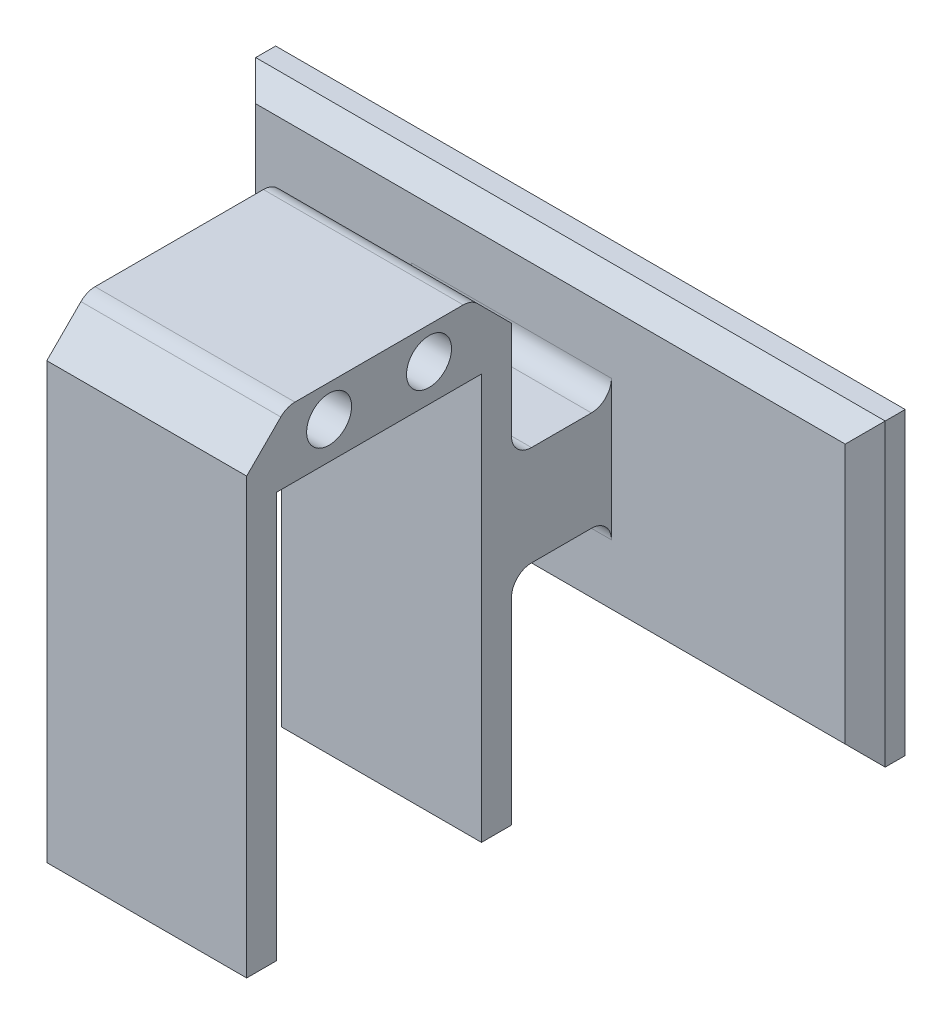
ISO-10303-21;
HEADER;
FILE_DESCRIPTION(('STEP AP214'),'2;1');
FILE_NAME('part.step','',(''),(''),'','','');
FILE_SCHEMA(('AUTOMOTIVE_DESIGN { 1 0 10303 214 1 1 1 1 }'));
ENDSEC;
DATA;
#1=APPLICATION_CONTEXT('core data for automotive mechanical design processes');
#2=APPLICATION_PROTOCOL_DEFINITION('international standard','automotive_design',2000,#1);
#3=PRODUCT_CONTEXT('',#1,'mechanical');
#4=PRODUCT('Part','Part','',(#3));
#5=PRODUCT_RELATED_PRODUCT_CATEGORY('part','',(#4));
#6=PRODUCT_DEFINITION_FORMATION('','',#4);
#7=PRODUCT_DEFINITION_CONTEXT('part definition',#1,'design');
#8=PRODUCT_DEFINITION('design','',#6,#7);
#9=PRODUCT_DEFINITION_SHAPE('','',#8);
#10=(LENGTH_UNIT() NAMED_UNIT(*) SI_UNIT(.MILLI.,.METRE.));
#11=(NAMED_UNIT(*) PLANE_ANGLE_UNIT() SI_UNIT($,.RADIAN.));
#12=(NAMED_UNIT(*) SI_UNIT($,.STERADIAN.) SOLID_ANGLE_UNIT());
#13=UNCERTAINTY_MEASURE_WITH_UNIT(LENGTH_MEASURE(1.E-05),#10,'distance_accuracy_value','');
#14=(GEOMETRIC_REPRESENTATION_CONTEXT(3) GLOBAL_UNCERTAINTY_ASSIGNED_CONTEXT((#13)) GLOBAL_UNIT_ASSIGNED_CONTEXT((#10,
#11,#12)) REPRESENTATION_CONTEXT('',''));
#15=CARTESIAN_POINT('',(0.,0.,0.));
#16=DIRECTION('',(0.,0.,1.));
#17=DIRECTION('',(1.,0.,0.));
#18=AXIS2_PLACEMENT_3D('',#15,#16,#17);
#19=CARTESIAN_POINT('',(20.,0.,-13.25));
#20=DIRECTION('',(0.,0.,1.));
#21=DIRECTION('',(0.,-1.,0.));
#22=AXIS2_PLACEMENT_3D('',#19,#20,#21);
#23=PLANE('',#22);
#24=DIRECTION('',(0.,1.,0.));
#25=VECTOR('',#24,1.);
#26=CARTESIAN_POINT('',(20.,0.,-13.25));
#27=LINE('',#26,#25);
#28=CARTESIAN_POINT('',(20.,13.423218072507,-13.25));
#29=VERTEX_POINT('',#28);
#30=CARTESIAN_POINT('',(20.,23.2,-13.25));
#31=VERTEX_POINT('',#30);
#32=EDGE_CURVE('E282',#29,#31,#27,.T.);
#33=ORIENTED_EDGE('',*,*,#32,.F.);
#34=DIRECTION('',(1.,0.,0.));
#35=VECTOR('',#34,1.);
#36=CARTESIAN_POINT('',(20.,13.423218072507,-13.25));
#37=LINE('',#36,#35);
#38=CARTESIAN_POINT('',(0.,13.423218072507,-13.25));
#39=VERTEX_POINT('',#38);
#40=EDGE_CURVE('E369',#29,#39,#37,.F.);
#41=ORIENTED_EDGE('',*,*,#40,.T.);
#42=DIRECTION('',(0.,1.,0.));
#43=VECTOR('',#42,1.);
#44=CARTESIAN_POINT('',(0.,0.,-13.25));
#45=LINE('',#44,#43);
#46=CARTESIAN_POINT('',(0.,23.2,-13.25));
#47=VERTEX_POINT('',#46);
#48=EDGE_CURVE('E302',#39,#47,#45,.T.);
#49=ORIENTED_EDGE('',*,*,#48,.T.);
#50=DIRECTION('',(1.,0.,0.));
#51=VECTOR('',#50,1.);
#52=CARTESIAN_POINT('',(20.,23.2,-13.25));
#53=LINE('',#52,#51);
#54=EDGE_CURVE('E332',#47,#31,#53,.T.);
#55=ORIENTED_EDGE('',*,*,#54,.T.);
#56=EDGE_LOOP('',(#33,#41,#49,#55));
#57=FACE_BOUND('',#56,.T.);
#58=ADVANCED_FACE('F43',(#57),#23,.F.);
#59=CARTESIAN_POINT('',(20.,24.,4.99999999999999));
#60=DIRECTION('',(-1.,0.,0.));
#61=DIRECTION('',(0.,0.,1.));
#62=AXIS2_PLACEMENT_3D('',#59,#60,#61);
#63=CYLINDRICAL_SURFACE('',#62,2.25);
#64=CARTESIAN_POINT('',(20.,24.,4.99999999999999));
#65=DIRECTION('',(1.,0.,0.));
#66=DIRECTION('',(0.,0.,-1.));
#67=AXIS2_PLACEMENT_3D('',#64,#65,#66);
#68=CIRCLE('',#67,2.25);
#69=CARTESIAN_POINT('',(20.,24.,2.74999999999999));
#70=VERTEX_POINT('',#69);
#71=EDGE_CURVE('E275',#70,#70,#68,.T.);
#72=ORIENTED_EDGE('',*,*,#71,.T.);
#73=EDGE_LOOP('',(#72));
#74=FACE_BOUND('',#73,.T.);
#75=CARTESIAN_POINT('',(10.,24.,4.99999999999999));
#76=DIRECTION('',(-1.,0.,0.));
#77=DIRECTION('',(0.,0.,1.));
#78=AXIS2_PLACEMENT_3D('',#75,#76,#77);
#79=CIRCLE('',#78,2.25);
#80=CARTESIAN_POINT('',(10.,24.,7.24999999999999));
#81=VERTEX_POINT('',#80);
#82=EDGE_CURVE('E263',#81,#81,#79,.T.);
#83=ORIENTED_EDGE('',*,*,#82,.T.);
#84=EDGE_LOOP('',(#83));
#85=FACE_BOUND('',#84,.T.);
#86=ADVANCED_FACE('F521',(#74,#85),#63,.F.);
#87=CARTESIAN_POINT('',(20.,24.,-5.00000000000001));
#88=DIRECTION('',(-1.,0.,0.));
#89=DIRECTION('',(0.,0.,1.));
#90=AXIS2_PLACEMENT_3D('',#87,#88,#89);
#91=CYLINDRICAL_SURFACE('',#90,2.25);
#92=CARTESIAN_POINT('',(20.,24.,-5.00000000000001));
#93=DIRECTION('',(1.,0.,0.));
#94=DIRECTION('',(0.,0.,-1.));
#95=AXIS2_PLACEMENT_3D('',#92,#93,#94);
#96=CIRCLE('',#95,2.25);
#97=CARTESIAN_POINT('',(20.,24.,-7.25000000000002));
#98=VERTEX_POINT('',#97);
#99=EDGE_CURVE('E272',#98,#98,#96,.T.);
#100=ORIENTED_EDGE('',*,*,#99,.T.);
#101=EDGE_LOOP('',(#100));
#102=FACE_BOUND('',#101,.T.);
#103=CARTESIAN_POINT('',(10.,24.,-5.00000000000001));
#104=DIRECTION('',(-1.,0.,0.));
#105=DIRECTION('',(0.,0.,1.));
#106=AXIS2_PLACEMENT_3D('',#103,#104,#105);
#107=CIRCLE('',#106,2.25);
#108=CARTESIAN_POINT('',(10.,24.,-2.75000000000001));
#109=VERTEX_POINT('',#108);
#110=EDGE_CURVE('E268',#109,#109,#107,.T.);
#111=ORIENTED_EDGE('',*,*,#110,.T.);
#112=EDGE_LOOP('',(#111));
#113=FACE_BOUND('',#112,.T.);
#114=ADVANCED_FACE('F526',(#102,#113),#91,.F.);
#115=CARTESIAN_POINT('',(20.,-20.3,0.));
#116=DIRECTION('',(0.,1.,0.));
#117=DIRECTION('',(0.,0.,1.));
#118=AXIS2_PLACEMENT_3D('',#115,#116,#117);
#119=PLANE('',#118);
#120=DIRECTION('',(0.,0.,-1.));
#121=VECTOR('',#120,1.);
#122=CARTESIAN_POINT('',(0.,-20.3,0.));
#123=LINE('',#122,#121);
#124=CARTESIAN_POINT('',(0.,-20.3,-10.25));
#125=VERTEX_POINT('',#124);
#126=CARTESIAN_POINT('',(0.,-20.3,-13.25));
#127=VERTEX_POINT('',#126);
#128=EDGE_CURVE('E271',#125,#127,#123,.T.);
#129=ORIENTED_EDGE('',*,*,#128,.T.);
#130=DIRECTION('',(-1.,0.,0.));
#131=VECTOR('',#130,1.);
#132=CARTESIAN_POINT('',(20.,-20.3,-13.25));
#133=LINE('',#132,#131);
#134=CARTESIAN_POINT('',(20.,-20.3,-13.25));
#135=VERTEX_POINT('',#134);
#136=EDGE_CURVE('E329',#135,#127,#133,.T.);
#137=ORIENTED_EDGE('',*,*,#136,.F.);
#138=DIRECTION('',(0.,0.,-1.));
#139=VECTOR('',#138,1.);
#140=CARTESIAN_POINT('',(20.,-20.3,0.));
#141=LINE('',#140,#139);
#142=CARTESIAN_POINT('',(20.,-20.3,-10.25));
#143=VERTEX_POINT('',#142);
#144=EDGE_CURVE('E279',#143,#135,#141,.T.);
#145=ORIENTED_EDGE('',*,*,#144,.F.);
#146=DIRECTION('',(-1.,0.,0.));
#147=VECTOR('',#146,1.);
#148=CARTESIAN_POINT('',(20.,-20.3,-10.25));
#149=LINE('',#148,#147);
#150=EDGE_CURVE('E299',#143,#125,#149,.T.);
#151=ORIENTED_EDGE('',*,*,#150,.T.);
#152=EDGE_LOOP('',(#129,#137,#145,#151));
#153=FACE_BOUND('',#152,.T.);
#154=ADVANCED_FACE('F500',(#153),#119,.F.);
#155=CARTESIAN_POINT('',(0.,-0.57678192749301,-13.25));
#156=VERTEX_POINT('',#155);
#157=EDGE_CURVE('E303',#127,#156,#45,.T.);
#158=ORIENTED_EDGE('',*,*,#157,.T.);
#159=DIRECTION('',(1.,0.,0.));
#160=VECTOR('',#159,1.);
#161=CARTESIAN_POINT('',(20.,-0.57678192749301,-13.25));
#162=LINE('',#161,#160);
#163=CARTESIAN_POINT('',(20.,-0.57678192749301,-13.25));
#164=VERTEX_POINT('',#163);
#165=EDGE_CURVE('E371',#156,#164,#162,.T.);
#166=ORIENTED_EDGE('',*,*,#165,.T.);
#167=EDGE_CURVE('E283',#135,#164,#27,.T.);
#168=ORIENTED_EDGE('',*,*,#167,.F.);
#169=ORIENTED_EDGE('',*,*,#136,.T.);
#170=EDGE_LOOP('',(#158,#166,#168,#169));
#171=FACE_BOUND('',#170,.T.);
#172=ADVANCED_FACE('F503',(#171),#23,.F.);
#173=CARTESIAN_POINT('',(20.,0.,13.25));
#174=DIRECTION('',(0.,0.,1.));
#175=DIRECTION('',(1.,0.,0.));
#176=AXIS2_PLACEMENT_3D('',#173,#174,#175);
#177=PLANE('',#176);
#178=DIRECTION('',(0.,1.,0.));
#179=VECTOR('',#178,1.);
#180=CARTESIAN_POINT('',(20.,0.,13.25));
#181=LINE('',#180,#179);
#182=CARTESIAN_POINT('',(20.,-20.3,13.25));
#183=VERTEX_POINT('',#182);
#184=CARTESIAN_POINT('',(20.,23.2,13.25));
#185=VERTEX_POINT('',#184);
#186=EDGE_CURVE('E286',#183,#185,#181,.T.);
#187=ORIENTED_EDGE('',*,*,#186,.T.);
#188=DIRECTION('',(-1.,0.,0.));
#189=VECTOR('',#188,1.);
#190=CARTESIAN_POINT('',(0.,23.2,13.25));
#191=LINE('',#190,#189);
#192=CARTESIAN_POINT('',(0.,23.2,13.25));
#193=VERTEX_POINT('',#192);
#194=EDGE_CURVE('E343',#185,#193,#191,.T.);
#195=ORIENTED_EDGE('',*,*,#194,.T.);
#196=DIRECTION('',(0.,1.,0.));
#197=VECTOR('',#196,1.);
#198=CARTESIAN_POINT('',(0.,0.,13.25));
#199=LINE('',#198,#197);
#200=CARTESIAN_POINT('',(0.,-20.3,13.25));
#201=VERTEX_POINT('',#200);
#202=EDGE_CURVE('E306',#201,#193,#199,.T.);
#203=ORIENTED_EDGE('',*,*,#202,.F.);
#204=DIRECTION('',(-1.,0.,0.));
#205=VECTOR('',#204,1.);
#206=CARTESIAN_POINT('',(20.,-20.3,13.25));
#207=LINE('',#206,#205);
#208=EDGE_CURVE('E327',#183,#201,#207,.T.);
#209=ORIENTED_EDGE('',*,*,#208,.F.);
#210=EDGE_LOOP('',(#187,#195,#203,#209));
#211=FACE_BOUND('',#210,.T.);
#212=ADVANCED_FACE('F478',(#211),#177,.T.);
#213=CARTESIAN_POINT('',(20.,-20.3,0.));
#214=DIRECTION('',(0.,-1.,0.));
#215=DIRECTION('',(0.,0.,-1.));
#216=AXIS2_PLACEMENT_3D('',#213,#214,#215);
#217=PLANE('',#216);
#218=DIRECTION('',(0.,0.,1.));
#219=VECTOR('',#218,1.);
#220=CARTESIAN_POINT('',(0.,-20.3,0.));
#221=LINE('',#220,#219);
#222=CARTESIAN_POINT('',(0.,-20.3,10.25));
#223=VERTEX_POINT('',#222);
#224=EDGE_CURVE('E309',#223,#201,#221,.T.);
#225=ORIENTED_EDGE('',*,*,#224,.F.);
#226=DIRECTION('',(-1.,0.,0.));
#227=VECTOR('',#226,1.);
#228=CARTESIAN_POINT('',(20.,-20.3,10.25));
#229=LINE('',#228,#227);
#230=CARTESIAN_POINT('',(20.,-20.3,10.25));
#231=VERTEX_POINT('',#230);
#232=EDGE_CURVE('E325',#231,#223,#229,.T.);
#233=ORIENTED_EDGE('',*,*,#232,.F.);
#234=DIRECTION('',(0.,0.,1.));
#235=VECTOR('',#234,1.);
#236=CARTESIAN_POINT('',(20.,-20.3,0.));
#237=LINE('',#236,#235);
#238=EDGE_CURVE('E289',#231,#183,#237,.T.);
#239=ORIENTED_EDGE('',*,*,#238,.T.);
#240=ORIENTED_EDGE('',*,*,#208,.T.);
#241=EDGE_LOOP('',(#225,#233,#239,#240));
#242=FACE_BOUND('',#241,.T.);
#243=ADVANCED_FACE('F483',(#242),#217,.T.);
#244=CARTESIAN_POINT('',(20.,0.,10.25));
#245=DIRECTION('',(0.,0.,1.));
#246=DIRECTION('',(1.,0.,0.));
#247=AXIS2_PLACEMENT_3D('',#244,#245,#246);
#248=PLANE('',#247);
#249=DIRECTION('',(0.,1.,0.));
#250=VECTOR('',#249,1.);
#251=CARTESIAN_POINT('',(0.,0.,10.25));
#252=LINE('',#251,#250);
#253=CARTESIAN_POINT('',(0.,20.3,10.25));
#254=VERTEX_POINT('',#253);
#255=EDGE_CURVE('E312',#223,#254,#252,.T.);
#256=ORIENTED_EDGE('',*,*,#255,.T.);
#257=DIRECTION('',(-1.,0.,0.));
#258=VECTOR('',#257,1.);
#259=CARTESIAN_POINT('',(20.,20.3,10.25));
#260=LINE('',#259,#258);
#261=CARTESIAN_POINT('',(20.,20.3,10.25));
#262=VERTEX_POINT('',#261);
#263=EDGE_CURVE('E322',#262,#254,#260,.T.);
#264=ORIENTED_EDGE('',*,*,#263,.F.);
#265=DIRECTION('',(0.,1.,0.));
#266=VECTOR('',#265,1.);
#267=CARTESIAN_POINT('',(20.,0.,10.25));
#268=LINE('',#267,#266);
#269=EDGE_CURVE('E292',#231,#262,#268,.T.);
#270=ORIENTED_EDGE('',*,*,#269,.F.);
#271=ORIENTED_EDGE('',*,*,#232,.T.);
#272=EDGE_LOOP('',(#256,#264,#270,#271));
#273=FACE_BOUND('',#272,.T.);
#274=ADVANCED_FACE('F491',(#273),#248,.F.);
#275=CARTESIAN_POINT('',(20.,20.3,0.));
#276=DIRECTION('',(0.,1.,0.));
#277=DIRECTION('',(0.,0.,1.));
#278=AXIS2_PLACEMENT_3D('',#275,#276,#277);
#279=PLANE('',#278);
#280=DIRECTION('',(0.,0.,-1.));
#281=VECTOR('',#280,1.);
#282=CARTESIAN_POINT('',(0.,20.3,0.));
#283=LINE('',#282,#281);
#284=CARTESIAN_POINT('',(0.,20.3,-10.25));
#285=VERTEX_POINT('',#284);
#286=EDGE_CURVE('E314',#254,#285,#283,.T.);
#287=ORIENTED_EDGE('',*,*,#286,.T.);
#288=DIRECTION('',(-1.,0.,0.));
#289=VECTOR('',#288,1.);
#290=CARTESIAN_POINT('',(20.,20.3,-10.25));
#291=LINE('',#290,#289);
#292=CARTESIAN_POINT('',(20.,20.3,-10.25));
#293=VERTEX_POINT('',#292);
#294=EDGE_CURVE('E320',#293,#285,#291,.T.);
#295=ORIENTED_EDGE('',*,*,#294,.F.);
#296=DIRECTION('',(0.,0.,-1.));
#297=VECTOR('',#296,1.);
#298=CARTESIAN_POINT('',(20.,20.3,0.));
#299=LINE('',#298,#297);
#300=EDGE_CURVE('E294',#262,#293,#299,.T.);
#301=ORIENTED_EDGE('',*,*,#300,.F.);
#302=ORIENTED_EDGE('',*,*,#263,.T.);
#303=EDGE_LOOP('',(#287,#295,#301,#302));
#304=FACE_BOUND('',#303,.T.);
#305=ADVANCED_FACE('F493',(#304),#279,.F.);
#306=CARTESIAN_POINT('',(20.,0.,-10.25));
#307=DIRECTION('',(0.,0.,1.));
#308=DIRECTION('',(1.,0.,0.));
#309=AXIS2_PLACEMENT_3D('',#306,#307,#308);
#310=PLANE('',#309);
#311=DIRECTION('',(0.,1.,0.));
#312=VECTOR('',#311,1.);
#313=CARTESIAN_POINT('',(0.,0.,-10.25));
#314=LINE('',#313,#312);
#315=EDGE_CURVE('E276',#125,#285,#314,.T.);
#316=ORIENTED_EDGE('',*,*,#315,.F.);
#317=ORIENTED_EDGE('',*,*,#150,.F.);
#318=DIRECTION('',(0.,1.,0.));
#319=VECTOR('',#318,1.);
#320=CARTESIAN_POINT('',(20.,0.,-10.25));
#321=LINE('',#320,#319);
#322=EDGE_CURVE('E296',#143,#293,#321,.T.);
#323=ORIENTED_EDGE('',*,*,#322,.T.);
#324=ORIENTED_EDGE('',*,*,#294,.T.);
#325=EDGE_LOOP('',(#316,#317,#323,#324));
#326=FACE_BOUND('',#325,.T.);
#327=ADVANCED_FACE('F496',(#326),#310,.T.);
#328=CARTESIAN_POINT('',(20.,0.,0.));
#329=DIRECTION('',(1.,0.,0.));
#330=DIRECTION('',(0.,0.,-1.));
#331=AXIS2_PLACEMENT_3D('',#328,#329,#330);
#332=PLANE('',#331);
#333=DIRECTION('',(0.,-0.707106781186546,-0.707106781186549));
#334=VECTOR('',#333,1.);
#335=CARTESIAN_POINT('',(20.,18.2250000000001,-18.225));
#336=LINE('',#335,#334);
#337=CARTESIAN_POINT('',(20.,26.6142135623731,-9.83578643762689));
#338=VERTEX_POINT('',#337);
#339=EDGE_CURVE('E335',#31,#338,#336,.F.);
#340=ORIENTED_EDGE('',*,*,#339,.T.);
#341=CARTESIAN_POINT('',(20.,25.2,-8.4215728752538));
#342=DIRECTION('',(1.,0.,0.));
#343=DIRECTION('',(0.,0.,-1.));
#344=AXIS2_PLACEMENT_3D('',#341,#342,#343);
#345=CIRCLE('',#344,2.);
#346=CARTESIAN_POINT('',(20.,27.2,-8.4215728752538));
#347=VERTEX_POINT('',#346);
#348=EDGE_CURVE('E362',#338,#347,#345,.T.);
#349=ORIENTED_EDGE('',*,*,#348,.T.);
#350=DIRECTION('',(0.,0.,-1.));
#351=VECTOR('',#350,1.);
#352=CARTESIAN_POINT('',(20.,27.2,13.25));
#353=LINE('',#352,#351);
#354=CARTESIAN_POINT('',(20.,27.2,8.42157287525382));
#355=VERTEX_POINT('',#354);
#356=EDGE_CURVE('E259',#355,#347,#353,.T.);
#357=ORIENTED_EDGE('',*,*,#356,.F.);
#358=CARTESIAN_POINT('',(20.,25.2,8.42157287525382));
#359=DIRECTION('',(1.,0.,0.));
#360=DIRECTION('',(0.,0.,-1.));
#361=AXIS2_PLACEMENT_3D('',#358,#359,#360);
#362=CIRCLE('',#361,2.);
#363=CARTESIAN_POINT('',(20.,26.6142135623731,9.83578643762692));
#364=VERTEX_POINT('',#363);
#365=EDGE_CURVE('E360',#355,#364,#362,.T.);
#366=ORIENTED_EDGE('',*,*,#365,.T.);
#367=DIRECTION('',(0.,-0.707106781186549,0.707106781186546));
#368=VECTOR('',#367,1.);
#369=CARTESIAN_POINT('',(20.,18.225,18.225));
#370=LINE('',#369,#368);
#371=EDGE_CURVE('E341',#364,#185,#370,.T.);
#372=ORIENTED_EDGE('',*,*,#371,.T.);
#373=ORIENTED_EDGE('',*,*,#186,.F.);
#374=ORIENTED_EDGE('',*,*,#238,.F.);
#375=ORIENTED_EDGE('',*,*,#269,.T.);
#376=ORIENTED_EDGE('',*,*,#300,.T.);
#377=ORIENTED_EDGE('',*,*,#322,.F.);
#378=ORIENTED_EDGE('',*,*,#144,.T.);
#379=ORIENTED_EDGE('',*,*,#167,.T.);
#380=CARTESIAN_POINT('',(20.,-0.57678192749301,-15.25));
#381=DIRECTION('',(1.,0.,0.));
#382=DIRECTION('',(0.,0.,-1.));
#383=AXIS2_PLACEMENT_3D('',#380,#381,#382);
#384=CIRCLE('',#383,2.);
#385=CARTESIAN_POINT('',(20.,1.42321807250699,-15.25));
#386=VERTEX_POINT('',#385);
#387=EDGE_CURVE('E381',#164,#386,#384,.F.);
#388=ORIENTED_EDGE('',*,*,#387,.T.);
#389=DIRECTION('',(0.,0.,-1.));
#390=VECTOR('',#389,1.);
#391=CARTESIAN_POINT('',(20.,1.42321807250699,-23.25));
#392=LINE('',#391,#390);
#393=CARTESIAN_POINT('',(20.,1.42321807250699,-21.25));
#394=VERTEX_POINT('',#393);
#395=EDGE_CURVE('E251',#386,#394,#392,.T.);
#396=ORIENTED_EDGE('',*,*,#395,.T.);
#397=CARTESIAN_POINT('',(20.,-0.57678192749301,-21.25));
#398=DIRECTION('',(1.,0.,0.));
#399=DIRECTION('',(0.,0.,-1.));
#400=AXIS2_PLACEMENT_3D('',#397,#398,#399);
#401=CIRCLE('',#400,2.);
#402=CARTESIAN_POINT('',(20.,-0.57678192749301,-23.25));
#403=VERTEX_POINT('',#402);
#404=EDGE_CURVE('E51',#394,#403,#401,.F.);
#405=ORIENTED_EDGE('',*,*,#404,.T.);
#406=DIRECTION('',(0.,1.,0.));
#407=VECTOR('',#406,1.);
#408=CARTESIAN_POINT('',(20.,11.423218072507,-23.25));
#409=LINE('',#408,#407);
#410=CARTESIAN_POINT('',(20.,13.423218072507,-23.25));
#411=VERTEX_POINT('',#410);
#412=EDGE_CURVE('E240',#403,#411,#409,.T.);
#413=ORIENTED_EDGE('',*,*,#412,.T.);
#414=CARTESIAN_POINT('',(20.,13.423218072507,-21.25));
#415=DIRECTION('',(1.,0.,0.));
#416=DIRECTION('',(0.,0.,-1.));
#417=AXIS2_PLACEMENT_3D('',#414,#415,#416);
#418=CIRCLE('',#417,2.);
#419=CARTESIAN_POINT('',(20.,11.423218072507,-21.25));
#420=VERTEX_POINT('',#419);
#421=EDGE_CURVE('E421',#411,#420,#418,.F.);
#422=ORIENTED_EDGE('',*,*,#421,.T.);
#423=DIRECTION('',(0.,0.,1.));
#424=VECTOR('',#423,1.);
#425=CARTESIAN_POINT('',(20.,11.423218072507,-13.25));
#426=LINE('',#425,#424);
#427=CARTESIAN_POINT('',(20.,11.423218072507,-15.25));
#428=VERTEX_POINT('',#427);
#429=EDGE_CURVE('E242',#420,#428,#426,.T.);
#430=ORIENTED_EDGE('',*,*,#429,.T.);
#431=CARTESIAN_POINT('',(20.,13.423218072507,-15.25));
#432=DIRECTION('',(1.,0.,0.));
#433=DIRECTION('',(0.,0.,-1.));
#434=AXIS2_PLACEMENT_3D('',#431,#432,#433);
#435=CIRCLE('',#434,2.);
#436=EDGE_CURVE('E377',#428,#29,#435,.F.);
#437=ORIENTED_EDGE('',*,*,#436,.T.);
#438=ORIENTED_EDGE('',*,*,#32,.T.);
#439=EDGE_LOOP('',(#340,#349,#357,#366,#372,#373,#374,#375,#376,#377,#378,#379,#388,#396,#405,
#413,#422,#430,#437,#438));
#440=FACE_BOUND('',#439,.T.);
#441=ORIENTED_EDGE('',*,*,#99,.F.);
#442=EDGE_LOOP('',(#441));
#443=FACE_BOUND('',#442,.T.);
#444=ORIENTED_EDGE('',*,*,#71,.F.);
#445=EDGE_LOOP('',(#444));
#446=FACE_BOUND('',#445,.T.);
#447=ADVANCED_FACE('F426',(#440,#443,#446),#332,.T.);
#448=CARTESIAN_POINT('',(0.,0.,0.));
#449=DIRECTION('',(1.,0.,0.));
#450=DIRECTION('',(0.,0.,-1.));
#451=AXIS2_PLACEMENT_3D('',#448,#449,#450);
#452=PLANE('',#451);
#453=DIRECTION('',(0.,0.,-1.));
#454=VECTOR('',#453,1.);
#455=CARTESIAN_POINT('',(0.,27.2,13.25));
#456=LINE('',#455,#454);
#457=CARTESIAN_POINT('',(0.,27.2,8.42157287525382));
#458=VERTEX_POINT('',#457);
#459=CARTESIAN_POINT('',(0.,27.2,-8.4215728752538));
#460=VERTEX_POINT('',#459);
#461=EDGE_CURVE('E260',#458,#460,#456,.T.);
#462=ORIENTED_EDGE('',*,*,#461,.T.);
#463=CARTESIAN_POINT('',(0.,25.2,-8.4215728752538));
#464=DIRECTION('',(1.,0.,0.));
#465=DIRECTION('',(0.,0.,-1.));
#466=AXIS2_PLACEMENT_3D('',#463,#464,#465);
#467=CIRCLE('',#466,2.);
#468=CARTESIAN_POINT('',(0.,26.6142135623731,-9.83578643762689));
#469=VERTEX_POINT('',#468);
#470=EDGE_CURVE('E356',#460,#469,#467,.F.);
#471=ORIENTED_EDGE('',*,*,#470,.T.);
#472=DIRECTION('',(0.,0.707106781186546,0.707106781186549));
#473=VECTOR('',#472,1.);
#474=CARTESIAN_POINT('',(0.,23.2,-13.25));
#475=LINE('',#474,#473);
#476=EDGE_CURVE('E338',#469,#47,#475,.F.);
#477=ORIENTED_EDGE('',*,*,#476,.T.);
#478=ORIENTED_EDGE('',*,*,#48,.F.);
#479=CARTESIAN_POINT('',(0.,13.423218072507,-15.25));
#480=DIRECTION('',(1.,0.,0.));
#481=DIRECTION('',(0.,0.,-1.));
#482=AXIS2_PLACEMENT_3D('',#479,#480,#481);
#483=CIRCLE('',#482,2.);
#484=CARTESIAN_POINT('',(0.,11.423218072507,-15.25));
#485=VERTEX_POINT('',#484);
#486=EDGE_CURVE('E379',#39,#485,#483,.T.);
#487=ORIENTED_EDGE('',*,*,#486,.T.);
#488=DIRECTION('',(0.,0.,-1.));
#489=VECTOR('',#488,1.);
#490=CARTESIAN_POINT('',(0.,11.423218072507,-13.25));
#491=LINE('',#490,#489);
#492=CARTESIAN_POINT('',(0.,11.423218072507,-21.25));
#493=VERTEX_POINT('',#492);
#494=EDGE_CURVE('E252',#485,#493,#491,.T.);
#495=ORIENTED_EDGE('',*,*,#494,.T.);
#496=CARTESIAN_POINT('',(0.,13.423218072507,-21.25));
#497=DIRECTION('',(1.,0.,0.));
#498=DIRECTION('',(0.,0.,-1.));
#499=AXIS2_PLACEMENT_3D('',#496,#497,#498);
#500=CIRCLE('',#499,2.);
#501=CARTESIAN_POINT('',(0.,13.423218072507,-23.25));
#502=VERTEX_POINT('',#501);
#503=EDGE_CURVE('E423',#493,#502,#500,.T.);
#504=ORIENTED_EDGE('',*,*,#503,.T.);
#505=DIRECTION('',(0.,-1.,0.));
#506=VECTOR('',#505,1.);
#507=CARTESIAN_POINT('',(0.,11.423218072507,-23.25));
#508=LINE('',#507,#506);
#509=CARTESIAN_POINT('',(0.,-0.57678192749301,-23.25));
#510=VERTEX_POINT('',#509);
#511=EDGE_CURVE('E250',#502,#510,#508,.T.);
#512=ORIENTED_EDGE('',*,*,#511,.T.);
#513=CARTESIAN_POINT('',(0.,-0.57678192749301,-21.25));
#514=DIRECTION('',(1.,0.,0.));
#515=DIRECTION('',(0.,0.,-1.));
#516=AXIS2_PLACEMENT_3D('',#513,#514,#515);
#517=CIRCLE('',#516,2.);
#518=CARTESIAN_POINT('',(0.,1.42321807250699,-21.25));
#519=VERTEX_POINT('',#518);
#520=EDGE_CURVE('E11',#510,#519,#517,.T.);
#521=ORIENTED_EDGE('',*,*,#520,.T.);
#522=DIRECTION('',(0.,0.,1.));
#523=VECTOR('',#522,1.);
#524=CARTESIAN_POINT('',(0.,1.42321807250699,-23.25));
#525=LINE('',#524,#523);
#526=CARTESIAN_POINT('',(0.,1.42321807250699,-15.25));
#527=VERTEX_POINT('',#526);
#528=EDGE_CURVE('E248',#519,#527,#525,.T.);
#529=ORIENTED_EDGE('',*,*,#528,.T.);
#530=CARTESIAN_POINT('',(0.,-0.57678192749301,-15.25));
#531=DIRECTION('',(1.,0.,0.));
#532=DIRECTION('',(0.,0.,-1.));
#533=AXIS2_PLACEMENT_3D('',#530,#531,#532);
#534=CIRCLE('',#533,2.);
#535=EDGE_CURVE('E383',#527,#156,#534,.T.);
#536=ORIENTED_EDGE('',*,*,#535,.T.);
#537=ORIENTED_EDGE('',*,*,#157,.F.);
#538=ORIENTED_EDGE('',*,*,#128,.F.);
#539=ORIENTED_EDGE('',*,*,#315,.T.);
#540=ORIENTED_EDGE('',*,*,#286,.F.);
#541=ORIENTED_EDGE('',*,*,#255,.F.);
#542=ORIENTED_EDGE('',*,*,#224,.T.);
#543=ORIENTED_EDGE('',*,*,#202,.T.);
#544=DIRECTION('',(0.,0.707106781186549,-0.707106781186546));
#545=VECTOR('',#544,1.);
#546=CARTESIAN_POINT('',(0.,27.2,9.25000000000001));
#547=LINE('',#546,#545);
#548=CARTESIAN_POINT('',(0.,26.6142135623731,9.83578643762692));
#549=VERTEX_POINT('',#548);
#550=EDGE_CURVE('E345',#193,#549,#547,.T.);
#551=ORIENTED_EDGE('',*,*,#550,.T.);
#552=CARTESIAN_POINT('',(0.,25.2,8.42157287525382));
#553=DIRECTION('',(1.,0.,0.));
#554=DIRECTION('',(0.,0.,-1.));
#555=AXIS2_PLACEMENT_3D('',#552,#553,#554);
#556=CIRCLE('',#555,2.);
#557=EDGE_CURVE('E354',#549,#458,#556,.F.);
#558=ORIENTED_EDGE('',*,*,#557,.T.);
#559=EDGE_LOOP('',(#462,#471,#477,#478,#487,#495,#504,#512,#521,#529,#536,#537,#538,#539,#540,
#541,#542,#543,#551,#558));
#560=FACE_BOUND('',#559,.T.);
#561=ADVANCED_FACE('F465',(#560),#452,.F.);
#562=CARTESIAN_POINT('',(10.,24.,-5.00000000000001));
#563=DIRECTION('',(-1.,0.,0.));
#564=DIRECTION('',(0.,0.,1.));
#565=AXIS2_PLACEMENT_3D('',#562,#563,#564);
#566=PLANE('',#565);
#567=ORIENTED_EDGE('',*,*,#110,.F.);
#568=EDGE_LOOP('',(#567));
#569=FACE_BOUND('',#568,.T.);
#570=ADVANCED_FACE('F740',(#569),#566,.F.);
#571=CARTESIAN_POINT('',(10.,24.,4.99999999999999));
#572=DIRECTION('',(-1.,0.,0.));
#573=DIRECTION('',(0.,0.,1.));
#574=AXIS2_PLACEMENT_3D('',#571,#572,#573);
#575=PLANE('',#574);
#576=ORIENTED_EDGE('',*,*,#82,.F.);
#577=EDGE_LOOP('',(#576));
#578=FACE_BOUND('',#577,.T.);
#579=ADVANCED_FACE('F730',(#578),#575,.F.);
#580=CARTESIAN_POINT('',(0.,27.2,13.25));
#581=DIRECTION('',(0.,-1.,0.));
#582=DIRECTION('',(0.,0.,-1.));
#583=AXIS2_PLACEMENT_3D('',#580,#581,#582);
#584=PLANE('',#583);
#585=ORIENTED_EDGE('',*,*,#356,.T.);
#586=DIRECTION('',(1.,0.,0.));
#587=VECTOR('',#586,1.);
#588=CARTESIAN_POINT('',(0.,27.2,-8.4215728752538));
#589=LINE('',#588,#587);
#590=EDGE_CURVE('E351',#347,#460,#589,.F.);
#591=ORIENTED_EDGE('',*,*,#590,.T.);
#592=ORIENTED_EDGE('',*,*,#461,.F.);
#593=DIRECTION('',(1.,0.,0.));
#594=VECTOR('',#593,1.);
#595=CARTESIAN_POINT('',(20.,27.2,8.42157287525382));
#596=LINE('',#595,#594);
#597=EDGE_CURVE('E348',#458,#355,#596,.T.);
#598=ORIENTED_EDGE('',*,*,#597,.T.);
#599=EDGE_LOOP('',(#585,#591,#592,#598));
#600=FACE_BOUND('',#599,.T.);
#601=ADVANCED_FACE('F463',(#600),#584,.F.);
#602=CARTESIAN_POINT('',(20.,23.2,-13.25));
#603=DIRECTION('',(0.,-0.707106781186549,0.707106781186546));
#604=DIRECTION('',(1.,0.,0.));
#605=AXIS2_PLACEMENT_3D('',#602,#603,#604);
#606=PLANE('',#605);
#607=ORIENTED_EDGE('',*,*,#476,.F.);
#608=DIRECTION('',(-1.,0.,0.));
#609=VECTOR('',#608,1.);
#610=CARTESIAN_POINT('',(20.,26.6142135623731,-9.83578643762689));
#611=LINE('',#610,#609);
#612=EDGE_CURVE('E358',#469,#338,#611,.F.);
#613=ORIENTED_EDGE('',*,*,#612,.T.);
#614=ORIENTED_EDGE('',*,*,#339,.F.);
#615=ORIENTED_EDGE('',*,*,#54,.F.);
#616=EDGE_LOOP('',(#607,#613,#614,#615));
#617=FACE_BOUND('',#616,.T.);
#618=ADVANCED_FACE('F454',(#617),#606,.F.);
#619=CARTESIAN_POINT('',(0.,27.2,9.25000000000001));
#620=DIRECTION('',(0.,0.707106781186546,0.707106781186549));
#621=DIRECTION('',(-1.,0.,0.));
#622=AXIS2_PLACEMENT_3D('',#619,#620,#621);
#623=PLANE('',#622);
#624=ORIENTED_EDGE('',*,*,#371,.F.);
#625=DIRECTION('',(1.,0.,0.));
#626=VECTOR('',#625,1.);
#627=CARTESIAN_POINT('',(0.,26.6142135623731,9.83578643762692));
#628=LINE('',#627,#626);
#629=EDGE_CURVE('E364',#364,#549,#628,.F.);
#630=ORIENTED_EDGE('',*,*,#629,.T.);
#631=ORIENTED_EDGE('',*,*,#550,.F.);
#632=ORIENTED_EDGE('',*,*,#194,.F.);
#633=EDGE_LOOP('',(#624,#630,#631,#632));
#634=FACE_BOUND('',#633,.T.);
#635=ADVANCED_FACE('F475',(#634),#623,.T.);
#636=CARTESIAN_POINT('',(0.,25.2,-8.4215728752538));
#637=DIRECTION('',(-1.,0.,0.));
#638=DIRECTION('',(0.,0.,1.));
#639=AXIS2_PLACEMENT_3D('',#636,#637,#638);
#640=CYLINDRICAL_SURFACE('',#639,2.);
#641=ORIENTED_EDGE('',*,*,#348,.F.);
#642=ORIENTED_EDGE('',*,*,#612,.F.);
#643=ORIENTED_EDGE('',*,*,#470,.F.);
#644=ORIENTED_EDGE('',*,*,#590,.F.);
#645=EDGE_LOOP('',(#641,#642,#643,#644));
#646=FACE_BOUND('',#645,.T.);
#647=ADVANCED_FACE('F460',(#646),#640,.T.);
#648=CARTESIAN_POINT('',(0.,25.2,8.42157287525382));
#649=DIRECTION('',(-1.,0.,0.));
#650=DIRECTION('',(0.,0.,1.));
#651=AXIS2_PLACEMENT_3D('',#648,#649,#650);
#652=CYLINDRICAL_SURFACE('',#651,2.);
#653=ORIENTED_EDGE('',*,*,#557,.F.);
#654=ORIENTED_EDGE('',*,*,#629,.F.);
#655=ORIENTED_EDGE('',*,*,#365,.F.);
#656=ORIENTED_EDGE('',*,*,#597,.F.);
#657=EDGE_LOOP('',(#653,#654,#655,#656));
#658=FACE_BOUND('',#657,.T.);
#659=ADVANCED_FACE('F470',(#658),#652,.T.);
#660=CARTESIAN_POINT('',(-14.142135623731,1.42321807250699,-23.25));
#661=DIRECTION('',(0.,-1.,0.));
#662=DIRECTION('',(0.,0.,-1.));
#663=AXIS2_PLACEMENT_3D('',#660,#661,#662);
#664=PLANE('',#663);
#665=ORIENTED_EDGE('',*,*,#528,.F.);
#666=DIRECTION('',(1.,0.,0.));
#667=VECTOR('',#666,1.);
#668=CARTESIAN_POINT('',(-14.142135623731,1.42321807250699,-21.25));
#669=LINE('',#668,#667);
#670=EDGE_CURVE('E419',#519,#394,#669,.T.);
#671=ORIENTED_EDGE('',*,*,#670,.T.);
#672=ORIENTED_EDGE('',*,*,#395,.F.);
#673=DIRECTION('',(1.,0.,0.));
#674=VECTOR('',#673,1.);
#675=CARTESIAN_POINT('',(-14.142135623731,1.42321807250699,-15.25));
#676=LINE('',#675,#674);
#677=EDGE_CURVE('E374',#386,#527,#676,.F.);
#678=ORIENTED_EDGE('',*,*,#677,.T.);
#679=EDGE_LOOP('',(#665,#671,#672,#678));
#680=FACE_BOUND('',#679,.T.);
#681=ADVANCED_FACE('F510',(#680),#664,.T.);
#682=CARTESIAN_POINT('',(-14.142135623731,11.423218072507,-13.25));
#683=DIRECTION('',(0.,1.,0.));
#684=DIRECTION('',(0.,0.,1.));
#685=AXIS2_PLACEMENT_3D('',#682,#683,#684);
#686=PLANE('',#685);
#687=ORIENTED_EDGE('',*,*,#429,.F.);
#688=DIRECTION('',(1.,0.,0.));
#689=VECTOR('',#688,1.);
#690=CARTESIAN_POINT('',(-14.142135623731,11.423218072507,-21.25));
#691=LINE('',#690,#689);
#692=EDGE_CURVE('E417',#420,#493,#691,.F.);
#693=ORIENTED_EDGE('',*,*,#692,.T.);
#694=ORIENTED_EDGE('',*,*,#494,.F.);
#695=DIRECTION('',(1.,0.,0.));
#696=VECTOR('',#695,1.);
#697=CARTESIAN_POINT('',(-14.142135623731,11.423218072507,-15.25));
#698=LINE('',#697,#696);
#699=EDGE_CURVE('E366',#485,#428,#698,.T.);
#700=ORIENTED_EDGE('',*,*,#699,.T.);
#701=EDGE_LOOP('',(#687,#693,#694,#700));
#702=FACE_BOUND('',#701,.T.);
#703=ADVANCED_FACE('F440',(#702),#686,.T.);
#704=CARTESIAN_POINT('',(-14.142135623731,13.423218072507,-15.25));
#705=DIRECTION('',(1.,0.,0.));
#706=DIRECTION('',(0.,0.,-1.));
#707=AXIS2_PLACEMENT_3D('',#704,#705,#706);
#708=CYLINDRICAL_SURFACE('',#707,2.);
#709=ORIENTED_EDGE('',*,*,#486,.F.);
#710=ORIENTED_EDGE('',*,*,#40,.F.);
#711=ORIENTED_EDGE('',*,*,#436,.F.);
#712=ORIENTED_EDGE('',*,*,#699,.F.);
#713=EDGE_LOOP('',(#709,#710,#711,#712));
#714=FACE_BOUND('',#713,.T.);
#715=ADVANCED_FACE('F445',(#714),#708,.F.);
#716=CARTESIAN_POINT('',(20.,-0.57678192749301,-15.25));
#717=DIRECTION('',(1.,0.,0.));
#718=DIRECTION('',(0.,0.,-1.));
#719=AXIS2_PLACEMENT_3D('',#716,#717,#718);
#720=CYLINDRICAL_SURFACE('',#719,2.);
#721=ORIENTED_EDGE('',*,*,#535,.F.);
#722=ORIENTED_EDGE('',*,*,#677,.F.);
#723=ORIENTED_EDGE('',*,*,#387,.F.);
#724=ORIENTED_EDGE('',*,*,#165,.F.);
#725=EDGE_LOOP('',(#721,#722,#723,#724));
#726=FACE_BOUND('',#725,.T.);
#727=ADVANCED_FACE('F507',(#726),#720,.F.);
#728=CARTESIAN_POINT('',(45.4,21.423218072507,-27.25));
#729=DIRECTION('',(-1.,0.,0.));
#730=DIRECTION('',(0.,0.,1.));
#731=AXIS2_PLACEMENT_3D('',#728,#729,#730);
#732=PLANE('',#731);
#733=DIRECTION('',(0.,0.,1.));
#734=VECTOR('',#733,1.);
#735=CARTESIAN_POINT('',(45.4,21.423218072507,-27.25));
#736=LINE('',#735,#734);
#737=CARTESIAN_POINT('',(45.4,21.423218072507,-27.25));
#738=VERTEX_POINT('',#737);
#739=CARTESIAN_POINT('',(45.4,21.423218072507,-25.25));
#740=VERTEX_POINT('',#739);
#741=EDGE_CURVE('E994',#738,#740,#736,.T.);
#742=ORIENTED_EDGE('',*,*,#741,.T.);
#743=DIRECTION('',(0.,-1.,0.));
#744=VECTOR('',#743,1.);
#745=CARTESIAN_POINT('',(45.4,21.423218072507,-25.25));
#746=LINE('',#745,#744);
#747=CARTESIAN_POINT('',(45.4,-8.57678192749301,-25.25));
#748=VERTEX_POINT('',#747);
#749=EDGE_CURVE('E239',#740,#748,#746,.T.);
#750=ORIENTED_EDGE('',*,*,#749,.T.);
#751=DIRECTION('',(0.,0.,1.));
#752=VECTOR('',#751,1.);
#753=CARTESIAN_POINT('',(45.4,-8.57678192749301,-27.25));
#754=LINE('',#753,#752);
#755=CARTESIAN_POINT('',(45.4,-8.57678192749301,-27.25));
#756=VERTEX_POINT('',#755);
#757=EDGE_CURVE('E219',#756,#748,#754,.T.);
#758=ORIENTED_EDGE('',*,*,#757,.F.);
#759=DIRECTION('',(0.,-1.,0.));
#760=VECTOR('',#759,1.);
#761=CARTESIAN_POINT('',(45.4,21.423218072507,-27.25));
#762=LINE('',#761,#760);
#763=EDGE_CURVE('E226',#738,#756,#762,.T.);
#764=ORIENTED_EDGE('',*,*,#763,.F.);
#765=EDGE_LOOP('',(#742,#750,#758,#764));
#766=FACE_BOUND('',#765,.T.);
#767=ADVANCED_FACE('F237',(#766),#732,.F.);
#768=CARTESIAN_POINT('',(45.4,-8.57678192749301,-27.25));
#769=DIRECTION('',(0.,1.,0.));
#770=DIRECTION('',(-1.,0.,0.));
#771=AXIS2_PLACEMENT_3D('',#768,#769,#770);
#772=PLANE('',#771);
#773=ORIENTED_EDGE('',*,*,#757,.T.);
#774=DIRECTION('',(-1.,0.,0.));
#775=VECTOR('',#774,1.);
#776=CARTESIAN_POINT('',(45.4,-8.57678192749301,-25.25));
#777=LINE('',#776,#775);
#778=CARTESIAN_POINT('',(-17.6,-8.57678192749301,-25.25));
#779=VERTEX_POINT('',#778);
#780=EDGE_CURVE('E397',#748,#779,#777,.T.);
#781=ORIENTED_EDGE('',*,*,#780,.T.);
#782=DIRECTION('',(0.,0.,1.));
#783=VECTOR('',#782,1.);
#784=CARTESIAN_POINT('',(-17.6,-8.57678192749301,-27.25));
#785=LINE('',#784,#783);
#786=CARTESIAN_POINT('',(-17.6,-8.57678192749301,-27.25));
#787=VERTEX_POINT('',#786);
#788=EDGE_CURVE('E222',#787,#779,#785,.T.);
#789=ORIENTED_EDGE('',*,*,#788,.F.);
#790=DIRECTION('',(-1.,0.,0.));
#791=VECTOR('',#790,1.);
#792=CARTESIAN_POINT('',(45.4,-8.57678192749301,-27.25));
#793=LINE('',#792,#791);
#794=EDGE_CURVE('E215',#756,#787,#793,.T.);
#795=ORIENTED_EDGE('',*,*,#794,.F.);
#796=EDGE_LOOP('',(#773,#781,#789,#795));
#797=FACE_BOUND('',#796,.T.);
#798=ADVANCED_FACE('F217',(#797),#772,.F.);
#799=CARTESIAN_POINT('',(-17.6,21.423218072507,-27.25));
#800=DIRECTION('',(1.,0.,0.));
#801=DIRECTION('',(0.,0.,-1.));
#802=AXIS2_PLACEMENT_3D('',#799,#800,#801);
#803=PLANE('',#802);
#804=ORIENTED_EDGE('',*,*,#788,.T.);
#805=DIRECTION('',(0.,1.,0.));
#806=VECTOR('',#805,1.);
#807=CARTESIAN_POINT('',(-17.6,21.423218072507,-25.25));
#808=LINE('',#807,#806);
#809=CARTESIAN_POINT('',(-17.6,21.423218072507,-25.25));
#810=VERTEX_POINT('',#809);
#811=EDGE_CURVE('E385',#779,#810,#808,.T.);
#812=ORIENTED_EDGE('',*,*,#811,.T.);
#813=DIRECTION('',(0.,0.,1.));
#814=VECTOR('',#813,1.);
#815=CARTESIAN_POINT('',(-17.6,21.423218072507,-27.25));
#816=LINE('',#815,#814);
#817=CARTESIAN_POINT('',(-17.6,21.423218072507,-27.25));
#818=VERTEX_POINT('',#817);
#819=EDGE_CURVE('E244',#818,#810,#816,.T.);
#820=ORIENTED_EDGE('',*,*,#819,.F.);
#821=DIRECTION('',(0.,1.,0.));
#822=VECTOR('',#821,1.);
#823=CARTESIAN_POINT('',(-17.6,21.423218072507,-27.25));
#824=LINE('',#823,#822);
#825=EDGE_CURVE('E225',#787,#818,#824,.T.);
#826=ORIENTED_EDGE('',*,*,#825,.F.);
#827=EDGE_LOOP('',(#804,#812,#820,#826));
#828=FACE_BOUND('',#827,.T.);
#829=ADVANCED_FACE('F650',(#828),#803,.F.);
#830=CARTESIAN_POINT('',(45.4,21.423218072507,-27.25));
#831=DIRECTION('',(0.,-1.,0.));
#832=DIRECTION('',(1.,0.,0.));
#833=AXIS2_PLACEMENT_3D('',#830,#831,#832);
#834=PLANE('',#833);
#835=ORIENTED_EDGE('',*,*,#819,.T.);
#836=DIRECTION('',(1.,0.,0.));
#837=VECTOR('',#836,1.);
#838=CARTESIAN_POINT('',(45.4,21.423218072507,-25.25));
#839=LINE('',#838,#837);
#840=EDGE_CURVE('E400',#810,#740,#839,.T.);
#841=ORIENTED_EDGE('',*,*,#840,.T.);
#842=ORIENTED_EDGE('',*,*,#741,.F.);
#843=DIRECTION('',(1.,0.,0.));
#844=VECTOR('',#843,1.);
#845=CARTESIAN_POINT('',(45.4,21.423218072507,-27.25));
#846=LINE('',#845,#844);
#847=EDGE_CURVE('E231',#818,#738,#846,.T.);
#848=ORIENTED_EDGE('',*,*,#847,.F.);
#849=EDGE_LOOP('',(#835,#841,#842,#848));
#850=FACE_BOUND('',#849,.T.);
#851=ADVANCED_FACE('F640',(#850),#834,.F.);
#852=CARTESIAN_POINT('',(0.,0.,-27.25));
#853=DIRECTION('',(0.,0.,-1.));
#854=DIRECTION('',(-1.,0.,0.));
#855=AXIS2_PLACEMENT_3D('',#852,#853,#854);
#856=PLANE('',#855);
#857=ORIENTED_EDGE('',*,*,#763,.T.);
#858=ORIENTED_EDGE('',*,*,#794,.T.);
#859=ORIENTED_EDGE('',*,*,#825,.T.);
#860=ORIENTED_EDGE('',*,*,#847,.T.);
#861=EDGE_LOOP('',(#857,#858,#859,#860));
#862=FACE_BOUND('',#861,.T.);
#863=ADVANCED_FACE('F229',(#862),#856,.T.);
#864=CARTESIAN_POINT('',(0.,0.,-23.25));
#865=DIRECTION('',(0.,0.,-1.));
#866=DIRECTION('',(-1.,0.,0.));
#867=AXIS2_PLACEMENT_3D('',#864,#865,#866);
#868=PLANE('',#867);
#869=DIRECTION('',(-1.,0.,0.));
#870=VECTOR('',#869,1.);
#871=CARTESIAN_POINT('',(0.,19.423218072507,-23.25));
#872=LINE('',#871,#870);
#873=CARTESIAN_POINT('',(43.4,19.423218072507,-23.25));
#874=VERTEX_POINT('',#873);
#875=CARTESIAN_POINT('',(-15.6,19.423218072507,-23.25));
#876=VERTEX_POINT('',#875);
#877=EDGE_CURVE('E388',#874,#876,#872,.T.);
#878=ORIENTED_EDGE('',*,*,#877,.T.);
#879=DIRECTION('',(0.,-1.,0.));
#880=VECTOR('',#879,1.);
#881=CARTESIAN_POINT('',(-15.6,0.,-23.25));
#882=LINE('',#881,#880);
#883=CARTESIAN_POINT('',(-15.6,-6.576781927493,-23.25));
#884=VERTEX_POINT('',#883);
#885=EDGE_CURVE('E394',#876,#884,#882,.T.);
#886=ORIENTED_EDGE('',*,*,#885,.T.);
#887=DIRECTION('',(1.,0.,0.));
#888=VECTOR('',#887,1.);
#889=CARTESIAN_POINT('',(0.,-6.57678192749301,-23.25));
#890=LINE('',#889,#888);
#891=CARTESIAN_POINT('',(43.4,-6.57678192749301,-23.25));
#892=VERTEX_POINT('',#891);
#893=EDGE_CURVE('E392',#884,#892,#890,.T.);
#894=ORIENTED_EDGE('',*,*,#893,.T.);
#895=DIRECTION('',(0.,1.,0.));
#896=VECTOR('',#895,1.);
#897=CARTESIAN_POINT('',(43.4,0.,-23.25));
#898=LINE('',#897,#896);
#899=EDGE_CURVE('E390',#892,#874,#898,.T.);
#900=ORIENTED_EDGE('',*,*,#899,.T.);
#901=EDGE_LOOP('',(#878,#886,#894,#900));
#902=FACE_BOUND('',#901,.T.);
#903=DIRECTION('',(1.,0.,0.));
#904=VECTOR('',#903,1.);
#905=CARTESIAN_POINT('',(0.,13.423218072507,-23.25));
#906=LINE('',#905,#904);
#907=EDGE_CURVE('E414',#502,#411,#906,.T.);
#908=ORIENTED_EDGE('',*,*,#907,.T.);
#909=ORIENTED_EDGE('',*,*,#412,.F.);
#910=DIRECTION('',(1.,0.,0.));
#911=VECTOR('',#910,1.);
#912=CARTESIAN_POINT('',(0.,-0.57678192749301,-23.25));
#913=LINE('',#912,#911);
#914=EDGE_CURVE('E402',#403,#510,#913,.F.);
#915=ORIENTED_EDGE('',*,*,#914,.T.);
#916=ORIENTED_EDGE('',*,*,#511,.F.);
#917=EDGE_LOOP('',(#908,#909,#915,#916));
#918=FACE_BOUND('',#917,.T.);
#919=ADVANCED_FACE('F431',(#902,#918),#868,.F.);
#920=CARTESIAN_POINT('',(45.4,21.423218072507,-25.25));
#921=DIRECTION('',(-0.707106781186545,0.,-0.70710678118655));
#922=DIRECTION('',(0.,-1.,0.));
#923=AXIS2_PLACEMENT_3D('',#920,#921,#922);
#924=PLANE('',#923);
#925=DIRECTION('',(0.577350269189628,0.577350269189626,-0.577350269189624));
#926=VECTOR('',#925,1.);
#927=CARTESIAN_POINT('',(45.4,21.423218072507,-25.25));
#928=LINE('',#927,#926);
#929=EDGE_CURVE('E407',#874,#740,#928,.T.);
#930=ORIENTED_EDGE('',*,*,#929,.F.);
#931=ORIENTED_EDGE('',*,*,#899,.F.);
#932=DIRECTION('',(0.577350269189627,-0.577350269189627,-0.577350269189623));
#933=VECTOR('',#932,1.);
#934=CARTESIAN_POINT('',(35.4,1.42321807250704,-15.25));
#935=LINE('',#934,#933);
#936=EDGE_CURVE('E235',#748,#892,#935,.F.);
#937=ORIENTED_EDGE('',*,*,#936,.F.);
#938=ORIENTED_EDGE('',*,*,#749,.F.);
#939=EDGE_LOOP('',(#930,#931,#937,#938));
#940=FACE_BOUND('',#939,.T.);
#941=ADVANCED_FACE('F579',(#940),#924,.F.);
#942=CARTESIAN_POINT('',(45.4,-8.57678192749301,-25.25));
#943=DIRECTION('',(0.,0.707106781186545,-0.70710678118655));
#944=DIRECTION('',(-1.,0.,0.));
#945=AXIS2_PLACEMENT_3D('',#942,#943,#944);
#946=PLANE('',#945);
#947=ORIENTED_EDGE('',*,*,#936,.T.);
#948=ORIENTED_EDGE('',*,*,#893,.F.);
#949=DIRECTION('',(-0.577350269189627,-0.577350269189627,-0.577350269189623));
#950=VECTOR('',#949,1.);
#951=CARTESIAN_POINT('',(3.40000000000009,12.4232180725071,-4.25000000000003));
#952=LINE('',#951,#950);
#953=EDGE_CURVE('E405',#779,#884,#952,.F.);
#954=ORIENTED_EDGE('',*,*,#953,.F.);
#955=ORIENTED_EDGE('',*,*,#780,.F.);
#956=EDGE_LOOP('',(#947,#948,#954,#955));
#957=FACE_BOUND('',#956,.T.);
#958=ADVANCED_FACE('F573',(#957),#946,.F.);
#959=CARTESIAN_POINT('',(45.4,21.423218072507,-25.25));
#960=DIRECTION('',(0.,-0.707106781186546,-0.707106781186549));
#961=DIRECTION('',(1.,0.,0.));
#962=AXIS2_PLACEMENT_3D('',#959,#960,#961);
#963=PLANE('',#962);
#964=ORIENTED_EDGE('',*,*,#929,.T.);
#965=ORIENTED_EDGE('',*,*,#840,.F.);
#966=DIRECTION('',(0.577350269189628,-0.577350269189626,0.577350269189624));
#967=VECTOR('',#966,1.);
#968=CARTESIAN_POINT('',(3.40000000000013,0.423218072506899,-4.25));
#969=LINE('',#968,#967);
#970=EDGE_CURVE('E403',#876,#810,#969,.F.);
#971=ORIENTED_EDGE('',*,*,#970,.F.);
#972=ORIENTED_EDGE('',*,*,#877,.F.);
#973=EDGE_LOOP('',(#964,#965,#971,#972));
#974=FACE_BOUND('',#973,.T.);
#975=ADVANCED_FACE('F566',(#974),#963,.F.);
#976=CARTESIAN_POINT('',(-17.6,21.423218072507,-25.25));
#977=DIRECTION('',(0.707106781186545,0.,-0.70710678118655));
#978=DIRECTION('',(0.,1.,0.));
#979=AXIS2_PLACEMENT_3D('',#976,#977,#978);
#980=PLANE('',#979);
#981=ORIENTED_EDGE('',*,*,#953,.T.);
#982=ORIENTED_EDGE('',*,*,#885,.F.);
#983=ORIENTED_EDGE('',*,*,#970,.T.);
#984=ORIENTED_EDGE('',*,*,#811,.F.);
#985=EDGE_LOOP('',(#981,#982,#983,#984));
#986=FACE_BOUND('',#985,.T.);
#987=ADVANCED_FACE('F560',(#986),#980,.F.);
#988=CARTESIAN_POINT('',(0.,13.423218072507,-21.25));
#989=DIRECTION('',(1.,0.,0.));
#990=DIRECTION('',(0.,0.,-1.));
#991=AXIS2_PLACEMENT_3D('',#988,#989,#990);
#992=CYLINDRICAL_SURFACE('',#991,2.);
#993=ORIENTED_EDGE('',*,*,#503,.F.);
#994=ORIENTED_EDGE('',*,*,#692,.F.);
#995=ORIENTED_EDGE('',*,*,#421,.F.);
#996=ORIENTED_EDGE('',*,*,#907,.F.);
#997=EDGE_LOOP('',(#993,#994,#995,#996));
#998=FACE_BOUND('',#997,.T.);
#999=ADVANCED_FACE('F435',(#998),#992,.F.);
#1000=CARTESIAN_POINT('',(-14.142135623731,-0.57678192749301,-21.25));
#1001=DIRECTION('',(1.,0.,0.));
#1002=DIRECTION('',(0.,0.,-1.));
#1003=AXIS2_PLACEMENT_3D('',#1000,#1001,#1002);
#1004=CYLINDRICAL_SURFACE('',#1003,2.);
#1005=ORIENTED_EDGE('',*,*,#520,.F.);
#1006=ORIENTED_EDGE('',*,*,#914,.F.);
#1007=ORIENTED_EDGE('',*,*,#404,.F.);
#1008=ORIENTED_EDGE('',*,*,#670,.F.);
#1009=EDGE_LOOP('',(#1005,#1006,#1007,#1008));
#1010=FACE_BOUND('',#1009,.T.);
#1011=ADVANCED_FACE('F45',(#1010),#1004,.F.);
#1012=CLOSED_SHELL('',(#58,#86,#114,#154,#172,#212,#243,#274,#305,#327,#447,#561,#570,#579,#601,
#618,#635,#647,#659,#681,#703,#715,#727,#767,#798,#829,#851,#863,#919,#941,#958,#975,#987,#999,#1011));
#1013=MANIFOLD_SOLID_BREP('B2',#1012);
#1014=ADVANCED_BREP_SHAPE_REPRESENTATION('',(#18,#1013),#14);
#1015=SHAPE_DEFINITION_REPRESENTATION(#9,#1014);
ENDSEC;
END-ISO-10303-21;
